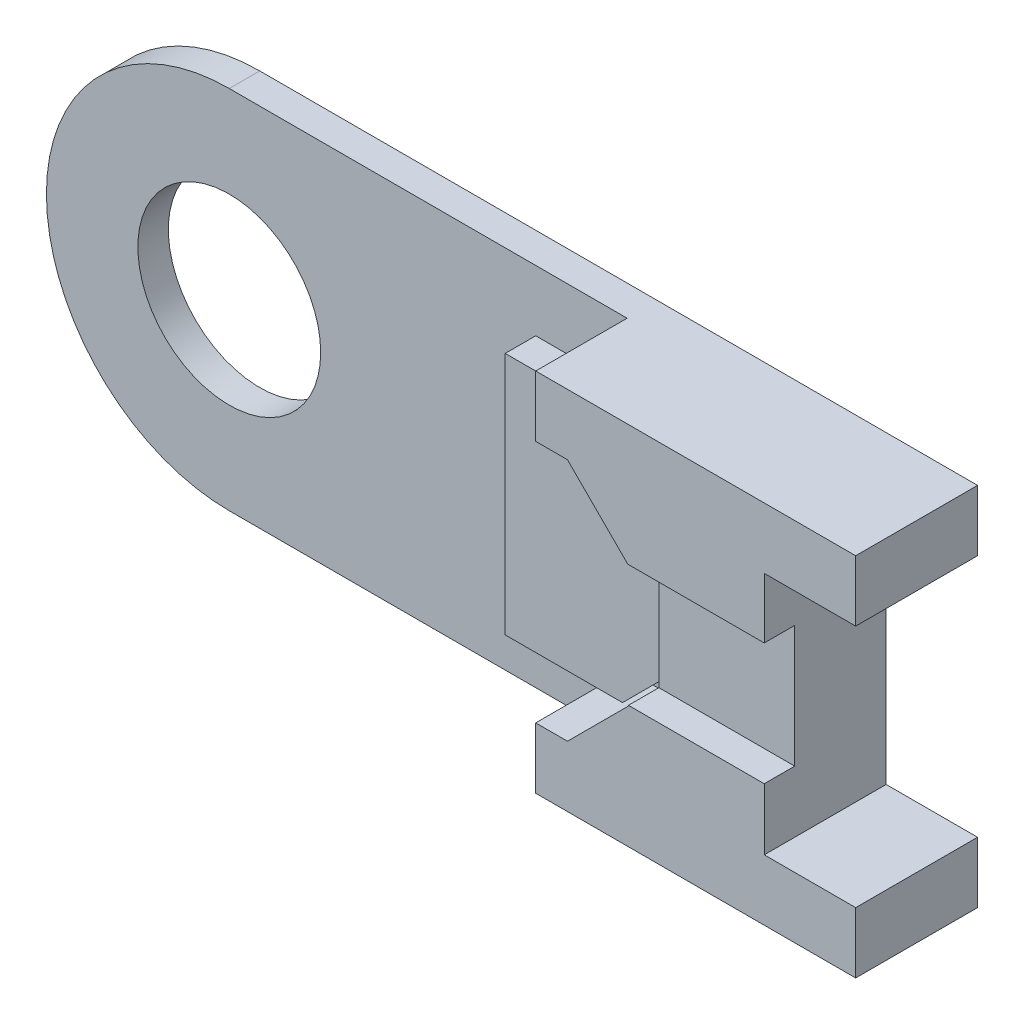
ISO-10303-21;
HEADER;
FILE_DESCRIPTION(('STEP AP214'),'2;1');
FILE_NAME('part.step','',(''),(''),'','','');
FILE_SCHEMA(('AUTOMOTIVE_DESIGN { 1 0 10303 214 1 1 1 1 }'));
ENDSEC;
DATA;
#1=APPLICATION_CONTEXT('core data for automotive mechanical design processes');
#2=APPLICATION_PROTOCOL_DEFINITION('international standard','automotive_design',2000,#1);
#3=PRODUCT_CONTEXT('',#1,'mechanical');
#4=PRODUCT('Part','Part','',(#3));
#5=PRODUCT_RELATED_PRODUCT_CATEGORY('part','',(#4));
#6=PRODUCT_DEFINITION_FORMATION('','',#4);
#7=PRODUCT_DEFINITION_CONTEXT('part definition',#1,'design');
#8=PRODUCT_DEFINITION('design','',#6,#7);
#9=PRODUCT_DEFINITION_SHAPE('','',#8);
#10=(LENGTH_UNIT() NAMED_UNIT(*) SI_UNIT(.MILLI.,.METRE.));
#11=(NAMED_UNIT(*) PLANE_ANGLE_UNIT() SI_UNIT($,.RADIAN.));
#12=(NAMED_UNIT(*) SI_UNIT($,.STERADIAN.) SOLID_ANGLE_UNIT());
#13=UNCERTAINTY_MEASURE_WITH_UNIT(LENGTH_MEASURE(1.E-05),#10,'distance_accuracy_value','');
#14=(GEOMETRIC_REPRESENTATION_CONTEXT(3) GLOBAL_UNCERTAINTY_ASSIGNED_CONTEXT((#13)) GLOBAL_UNIT_ASSIGNED_CONTEXT((#10,
#11,#12)) REPRESENTATION_CONTEXT('',''));
#15=CARTESIAN_POINT('',(0.,0.,0.));
#16=DIRECTION('',(0.,0.,1.));
#17=DIRECTION('',(1.,0.,0.));
#18=AXIS2_PLACEMENT_3D('',#15,#16,#17);
#19=CARTESIAN_POINT('',(-84.3434192007782,60.,10.));
#20=DIRECTION('',(0.,0.,1.));
#21=DIRECTION('',(1.,0.,0.));
#22=AXIS2_PLACEMENT_3D('',#19,#20,#21);
#23=PLANE('',#22);
#24=CARTESIAN_POINT('',(-84.3434192007782,60.,10.));
#25=DIRECTION('',(0.,0.,1.));
#26=DIRECTION('',(1.,0.,0.));
#27=AXIS2_PLACEMENT_3D('',#24,#25,#26);
#28=CIRCLE('',#27,30.);
#29=CARTESIAN_POINT('',(-54.3434192007782,60.,10.));
#30=VERTEX_POINT('',#29);
#31=EDGE_CURVE('E358',#30,#30,#28,.T.);
#32=ORIENTED_EDGE('',*,*,#31,.F.);
#33=EDGE_LOOP('',(#32));
#34=FACE_BOUND('',#33,.T.);
#35=DIRECTION('',(0.,-1.,0.));
#36=VECTOR('',#35,1.);
#37=CARTESIAN_POINT('',(16.2070441422371,100.,10.));
#38=LINE('',#37,#36);
#39=CARTESIAN_POINT('',(16.2070441422371,100.,10.));
#40=VERTEX_POINT('',#39);
#41=CARTESIAN_POINT('',(16.2070441422371,20.,10.));
#42=VERTEX_POINT('',#41);
#43=EDGE_CURVE('E250',#40,#42,#38,.T.);
#44=ORIENTED_EDGE('',*,*,#43,.F.);
#45=DIRECTION('',(-1.,0.,0.));
#46=VECTOR('',#45,1.);
#47=CARTESIAN_POINT('',(46.2070441422371,100.,10.));
#48=LINE('',#47,#46);
#49=CARTESIAN_POINT('',(46.2070441422371,100.,10.));
#50=VERTEX_POINT('',#49);
#51=EDGE_CURVE('E229',#50,#40,#48,.T.);
#52=ORIENTED_EDGE('',*,*,#51,.F.);
#53=DIRECTION('',(0.,1.,0.));
#54=VECTOR('',#53,1.);
#55=CARTESIAN_POINT('',(46.2070441422371,60.,10.));
#56=LINE('',#55,#54);
#57=CARTESIAN_POINT('',(46.2070441422371,120.,10.));
#58=VERTEX_POINT('',#57);
#59=EDGE_CURVE('E353',#50,#58,#56,.T.);
#60=ORIENTED_EDGE('',*,*,#59,.T.);
#61=DIRECTION('',(-1.,0.,0.));
#62=VECTOR('',#61,1.);
#63=CARTESIAN_POINT('',(46.2070441422371,120.,10.));
#64=LINE('',#63,#62);
#65=CARTESIAN_POINT('',(-84.3434192007782,120.,10.));
#66=VERTEX_POINT('',#65);
#67=EDGE_CURVE('E367',#58,#66,#64,.T.);
#68=ORIENTED_EDGE('',*,*,#67,.T.);
#69=CARTESIAN_POINT('',(-84.3434192007782,60.,10.));
#70=DIRECTION('',(0.,0.,1.));
#71=DIRECTION('',(1.,0.,0.));
#72=AXIS2_PLACEMENT_3D('',#69,#70,#71);
#73=CIRCLE('',#72,60.);
#74=CARTESIAN_POINT('',(-84.3434192007782,0.,10.));
#75=VERTEX_POINT('',#74);
#76=EDGE_CURVE('E370',#66,#75,#73,.T.);
#77=ORIENTED_EDGE('',*,*,#76,.T.);
#78=DIRECTION('',(1.,0.,0.));
#79=VECTOR('',#78,1.);
#80=CARTESIAN_POINT('',(0.,0.,10.));
#81=LINE('',#80,#79);
#82=CARTESIAN_POINT('',(46.2070441422371,0.,10.));
#83=VERTEX_POINT('',#82);
#84=EDGE_CURVE('E364',#75,#83,#81,.T.);
#85=ORIENTED_EDGE('',*,*,#84,.T.);
#86=CARTESIAN_POINT('',(46.2070441422371,20.,10.));
#87=VERTEX_POINT('',#86);
#88=EDGE_CURVE('E354',#83,#87,#56,.T.);
#89=ORIENTED_EDGE('',*,*,#88,.T.);
#90=DIRECTION('',(1.,0.,0.));
#91=VECTOR('',#90,1.);
#92=CARTESIAN_POINT('',(46.2070441422371,20.,10.));
#93=LINE('',#92,#91);
#94=EDGE_CURVE('E252',#42,#87,#93,.T.);
#95=ORIENTED_EDGE('',*,*,#94,.F.);
#96=EDGE_LOOP('',(#44,#52,#60,#68,#77,#85,#89,#95));
#97=FACE_BOUND('',#96,.T.);
#98=ADVANCED_FACE('F38',(#34,#97),#23,.T.);
#99=DIRECTION('',(0.,1.,0.));
#100=VECTOR('',#99,1.);
#101=CARTESIAN_POINT('',(76.6336353854819,80.,10.));
#102=LINE('',#101,#100);
#103=CARTESIAN_POINT('',(76.6336353854819,40.,10.));
#104=VERTEX_POINT('',#103);
#105=CARTESIAN_POINT('',(76.6336353854819,41.9402051154966,10.));
#106=VERTEX_POINT('',#105);
#107=EDGE_CURVE('E265',#104,#106,#102,.T.);
#108=ORIENTED_EDGE('',*,*,#107,.T.);
#109=DIRECTION('',(0.707106781186548,0.707106781186548,0.));
#110=VECTOR('',#109,1.);
#111=CARTESIAN_POINT('',(54.6934302699853,20.,10.));
#112=LINE('',#111,#110);
#113=CARTESIAN_POINT('',(54.6934302699853,20.,10.));
#114=VERTEX_POINT('',#113);
#115=EDGE_CURVE('E223',#114,#106,#112,.T.);
#116=ORIENTED_EDGE('',*,*,#115,.F.);
#117=DIRECTION('',(1.,0.,0.));
#118=VECTOR('',#117,1.);
#119=CARTESIAN_POINT('',(19.5990862433128,20.,10.));
#120=LINE('',#119,#118);
#121=CARTESIAN_POINT('',(56.6336353854819,20.,10.));
#122=VERTEX_POINT('',#121);
#123=EDGE_CURVE('E259',#114,#122,#120,.T.);
#124=ORIENTED_EDGE('',*,*,#123,.T.);
#125=DIRECTION('',(0.707106781186548,0.707106781186548,0.));
#126=VECTOR('',#125,1.);
#127=CARTESIAN_POINT('',(56.6336353854819,20.,10.));
#128=LINE('',#127,#126);
#129=EDGE_CURVE('E261',#122,#104,#128,.T.);
#130=ORIENTED_EDGE('',*,*,#129,.T.);
#131=EDGE_LOOP('',(#108,#116,#124,#130));
#132=FACE_BOUND('',#131,.T.);
#133=ADVANCED_FACE('F455',(#132),#23,.T.);
#134=CARTESIAN_POINT('',(19.5990862433128,20.,10.));
#135=DIRECTION('',(0.,-1.,0.));
#136=DIRECTION('',(1.,0.,0.));
#137=AXIS2_PLACEMENT_3D('',#134,#135,#136);
#138=PLANE('',#137);
#139=DIRECTION('',(0.,0.,-1.));
#140=VECTOR('',#139,1.);
#141=CARTESIAN_POINT('',(54.6934302699853,20.,20.));
#142=LINE('',#141,#140);
#143=CARTESIAN_POINT('',(54.6934302699853,20.,20.));
#144=VERTEX_POINT('',#143);
#145=EDGE_CURVE('E256',#144,#114,#142,.T.);
#146=ORIENTED_EDGE('',*,*,#145,.F.);
#147=DIRECTION('',(1.,0.,0.));
#148=VECTOR('',#147,1.);
#149=CARTESIAN_POINT('',(16.2070441422371,20.,20.));
#150=LINE('',#149,#148);
#151=CARTESIAN_POINT('',(46.2070441422371,20.,20.));
#152=VERTEX_POINT('',#151);
#153=EDGE_CURVE('E238',#152,#144,#150,.T.);
#154=ORIENTED_EDGE('',*,*,#153,.F.);
#155=DIRECTION('',(0.,0.,-1.));
#156=VECTOR('',#155,1.);
#157=CARTESIAN_POINT('',(46.2070441422371,20.,40.));
#158=LINE('',#157,#156);
#159=CARTESIAN_POINT('',(46.2070441422371,20.,40.));
#160=VERTEX_POINT('',#159);
#161=EDGE_CURVE('E293',#160,#152,#158,.T.);
#162=ORIENTED_EDGE('',*,*,#161,.F.);
#163=DIRECTION('',(1.,0.,0.));
#164=VECTOR('',#163,1.);
#165=CARTESIAN_POINT('',(19.5990862433128,20.,40.));
#166=LINE('',#165,#164);
#167=CARTESIAN_POINT('',(56.6336353854819,20.,40.));
#168=VERTEX_POINT('',#167);
#169=EDGE_CURVE('E232',#160,#168,#166,.T.);
#170=ORIENTED_EDGE('',*,*,#169,.T.);
#171=DIRECTION('',(0.,0.,1.));
#172=VECTOR('',#171,1.);
#173=CARTESIAN_POINT('',(56.6336353854819,20.,10.));
#174=LINE('',#173,#172);
#175=EDGE_CURVE('E268',#122,#168,#174,.T.);
#176=ORIENTED_EDGE('',*,*,#175,.F.);
#177=ORIENTED_EDGE('',*,*,#123,.F.);
#178=EDGE_LOOP('',(#146,#154,#162,#170,#176,#177));
#179=FACE_BOUND('',#178,.T.);
#180=ADVANCED_FACE('F451',(#179),#138,.F.);
#181=CARTESIAN_POINT('',(76.6336353854819,80.,10.));
#182=DIRECTION('',(1.,0.,0.));
#183=DIRECTION('',(0.,1.,0.));
#184=AXIS2_PLACEMENT_3D('',#181,#182,#183);
#185=PLANE('',#184);
#186=DIRECTION('',(0.,0.,-1.));
#187=VECTOR('',#186,1.);
#188=CARTESIAN_POINT('',(76.6336353854819,41.9402051154966,20.));
#189=LINE('',#188,#187);
#190=CARTESIAN_POINT('',(76.6336353854819,41.9402051154966,20.));
#191=VERTEX_POINT('',#190);
#192=EDGE_CURVE('E53',#191,#106,#189,.T.);
#193=ORIENTED_EDGE('',*,*,#192,.T.);
#194=ORIENTED_EDGE('',*,*,#107,.F.);
#195=DIRECTION('',(0.,0.,1.));
#196=VECTOR('',#195,1.);
#197=CARTESIAN_POINT('',(76.6336353854819,40.,10.));
#198=LINE('',#197,#196);
#199=CARTESIAN_POINT('',(76.6336353854819,40.,40.));
#200=VERTEX_POINT('',#199);
#201=EDGE_CURVE('E284',#104,#200,#198,.T.);
#202=ORIENTED_EDGE('',*,*,#201,.T.);
#203=DIRECTION('',(0.,1.,0.));
#204=VECTOR('',#203,1.);
#205=CARTESIAN_POINT('',(76.6336353854819,80.,40.));
#206=LINE('',#205,#204);
#207=CARTESIAN_POINT('',(76.6336353854819,40.2090922157293,40.));
#208=VERTEX_POINT('',#207);
#209=EDGE_CURVE('E273',#200,#208,#206,.T.);
#210=ORIENTED_EDGE('',*,*,#209,.T.);
#211=DIRECTION('',(0.,0.,1.));
#212=VECTOR('',#211,1.);
#213=CARTESIAN_POINT('',(76.6336353854819,40.2090922157293,30.));
#214=LINE('',#213,#212);
#215=CARTESIAN_POINT('',(76.6336353854819,40.2090922157293,30.));
#216=VERTEX_POINT('',#215);
#217=EDGE_CURVE('E61',#216,#208,#214,.T.);
#218=ORIENTED_EDGE('',*,*,#217,.F.);
#219=DIRECTION('',(0.,-1.,0.));
#220=VECTOR('',#219,1.);
#221=CARTESIAN_POINT('',(76.6336353854819,0.,30.));
#222=LINE('',#221,#220);
#223=CARTESIAN_POINT('',(76.6336353854819,80.,30.));
#224=VERTEX_POINT('',#223);
#225=EDGE_CURVE('E46',#224,#216,#222,.T.);
#226=ORIENTED_EDGE('',*,*,#225,.F.);
#227=DIRECTION('',(0.,0.,1.));
#228=VECTOR('',#227,1.);
#229=CARTESIAN_POINT('',(76.6336353854819,80.,10.));
#230=LINE('',#229,#228);
#231=CARTESIAN_POINT('',(76.6336353854819,80.,20.));
#232=VERTEX_POINT('',#231);
#233=EDGE_CURVE('E282',#232,#224,#230,.T.);
#234=ORIENTED_EDGE('',*,*,#233,.F.);
#235=DIRECTION('',(0.,1.,0.));
#236=VECTOR('',#235,1.);
#237=CARTESIAN_POINT('',(76.6336353854819,41.9402051154966,20.));
#238=LINE('',#237,#236);
#239=EDGE_CURVE('E245',#191,#232,#238,.T.);
#240=ORIENTED_EDGE('',*,*,#239,.F.);
#241=EDGE_LOOP('',(#193,#194,#202,#210,#218,#226,#234,#240));
#242=FACE_BOUND('',#241,.T.);
#243=ADVANCED_FACE('F443',(#242),#185,.F.);
#244=CARTESIAN_POINT('',(46.2070441422371,120.,40.));
#245=DIRECTION('',(1.,0.,0.));
#246=DIRECTION('',(0.,1.,0.));
#247=AXIS2_PLACEMENT_3D('',#244,#245,#246);
#248=PLANE('',#247);
#249=ORIENTED_EDGE('',*,*,#59,.F.);
#250=DIRECTION('',(0.,0.,1.));
#251=VECTOR('',#250,1.);
#252=CARTESIAN_POINT('',(46.2070441422371,100.,40.));
#253=LINE('',#252,#251);
#254=CARTESIAN_POINT('',(46.2070441422371,100.,20.));
#255=VERTEX_POINT('',#254);
#256=EDGE_CURVE('E297',#50,#255,#253,.T.);
#257=ORIENTED_EDGE('',*,*,#256,.T.);
#258=CARTESIAN_POINT('',(46.2070441422371,100.,40.));
#259=VERTEX_POINT('',#258);
#260=EDGE_CURVE('E296',#255,#259,#253,.T.);
#261=ORIENTED_EDGE('',*,*,#260,.T.);
#262=DIRECTION('',(0.,-1.,0.));
#263=VECTOR('',#262,1.);
#264=CARTESIAN_POINT('',(46.2070441422371,120.,40.));
#265=LINE('',#264,#263);
#266=CARTESIAN_POINT('',(46.2070441422371,120.,40.));
#267=VERTEX_POINT('',#266);
#268=EDGE_CURVE('E341',#267,#259,#265,.T.);
#269=ORIENTED_EDGE('',*,*,#268,.F.);
#270=DIRECTION('',(0.,0.,-1.));
#271=VECTOR('',#270,1.);
#272=CARTESIAN_POINT('',(46.2070441422371,120.,40.));
#273=LINE('',#272,#271);
#274=EDGE_CURVE('E350',#267,#58,#273,.T.);
#275=ORIENTED_EDGE('',*,*,#274,.T.);
#276=EDGE_LOOP('',(#249,#257,#261,#269,#275));
#277=FACE_BOUND('',#276,.T.);
#278=ADVANCED_FACE('F510',(#277),#248,.F.);
#279=CARTESIAN_POINT('',(0.,0.,40.));
#280=DIRECTION('',(0.,0.,-1.));
#281=DIRECTION('',(-1.,0.,0.));
#282=AXIS2_PLACEMENT_3D('',#279,#280,#281);
#283=PLANE('',#282);
#284=ORIENTED_EDGE('',*,*,#268,.T.);
#285=DIRECTION('',(-1.,0.,0.));
#286=VECTOR('',#285,1.);
#287=CARTESIAN_POINT('',(19.5990862433128,100.,40.));
#288=LINE('',#287,#286);
#289=CARTESIAN_POINT('',(56.6336353854819,100.,40.));
#290=VERTEX_POINT('',#289);
#291=EDGE_CURVE('E262',#290,#259,#288,.T.);
#292=ORIENTED_EDGE('',*,*,#291,.F.);
#293=DIRECTION('',(-0.707106781186547,0.707106781186548,0.));
#294=VECTOR('',#293,1.);
#295=CARTESIAN_POINT('',(56.6336353854819,100.,40.));
#296=LINE('',#295,#294);
#297=CARTESIAN_POINT('',(76.5427291982134,80.0909061872685,40.));
#298=VERTEX_POINT('',#297);
#299=EDGE_CURVE('E275',#298,#290,#296,.T.);
#300=ORIENTED_EDGE('',*,*,#299,.F.);
#301=DIRECTION('',(0.,-1.,0.));
#302=VECTOR('',#301,1.);
#303=CARTESIAN_POINT('',(76.5427291982134,80.2090922157293,40.));
#304=LINE('',#303,#302);
#305=CARTESIAN_POINT('',(76.5427291982134,80.2090922157293,40.));
#306=VERTEX_POINT('',#305);
#307=EDGE_CURVE('E311',#306,#298,#304,.T.);
#308=ORIENTED_EDGE('',*,*,#307,.F.);
#309=DIRECTION('',(-1.,0.,0.));
#310=VECTOR('',#309,1.);
#311=CARTESIAN_POINT('',(121.542729198213,80.2090922157293,40.));
#312=LINE('',#311,#310);
#313=CARTESIAN_POINT('',(121.207044142237,80.2090922157293,40.));
#314=VERTEX_POINT('',#313);
#315=EDGE_CURVE('E300',#314,#306,#312,.T.);
#316=ORIENTED_EDGE('',*,*,#315,.F.);
#317=DIRECTION('',(0.,-1.,0.));
#318=VECTOR('',#317,1.);
#319=CARTESIAN_POINT('',(121.207044142237,0.,40.));
#320=LINE('',#319,#318);
#321=CARTESIAN_POINT('',(121.207044142237,100.,40.));
#322=VERTEX_POINT('',#321);
#323=EDGE_CURVE('E394',#322,#314,#320,.T.);
#324=ORIENTED_EDGE('',*,*,#323,.F.);
#325=DIRECTION('',(1.,0.,0.));
#326=VECTOR('',#325,1.);
#327=CARTESIAN_POINT('',(0.,100.,40.));
#328=LINE('',#327,#326);
#329=CARTESIAN_POINT('',(151.207044142237,100.,40.));
#330=VERTEX_POINT('',#329);
#331=EDGE_CURVE('E400',#322,#330,#328,.T.);
#332=ORIENTED_EDGE('',*,*,#331,.T.);
#333=DIRECTION('',(0.,1.,0.));
#334=VECTOR('',#333,1.);
#335=CARTESIAN_POINT('',(151.207044142237,120.,40.));
#336=LINE('',#335,#334);
#337=CARTESIAN_POINT('',(151.207044142237,120.,40.));
#338=VERTEX_POINT('',#337);
#339=EDGE_CURVE('E334',#330,#338,#336,.T.);
#340=ORIENTED_EDGE('',*,*,#339,.T.);
#341=DIRECTION('',(-1.,0.,0.));
#342=VECTOR('',#341,1.);
#343=CARTESIAN_POINT('',(151.207044142237,120.,40.));
#344=LINE('',#343,#342);
#345=EDGE_CURVE('E338',#338,#267,#344,.T.);
#346=ORIENTED_EDGE('',*,*,#345,.T.);
#347=EDGE_LOOP('',(#284,#292,#300,#308,#316,#324,#332,#340,#346));
#348=FACE_BOUND('',#347,.T.);
#349=ADVANCED_FACE('F437',(#348),#283,.F.);
#350=CARTESIAN_POINT('',(151.207044142237,0.,10.));
#351=DIRECTION('',(-1.,0.,0.));
#352=DIRECTION('',(0.,0.,1.));
#353=AXIS2_PLACEMENT_3D('',#350,#351,#352);
#354=PLANE('',#353);
#355=ORIENTED_EDGE('',*,*,#339,.F.);
#356=DIRECTION('',(0.,0.,1.));
#357=VECTOR('',#356,1.);
#358=CARTESIAN_POINT('',(151.207044142237,100.,55.9858593321826));
#359=LINE('',#358,#357);
#360=CARTESIAN_POINT('',(151.207044142237,100.,0.));
#361=VERTEX_POINT('',#360);
#362=EDGE_CURVE('E322',#361,#330,#359,.T.);
#363=ORIENTED_EDGE('',*,*,#362,.F.);
#364=DIRECTION('',(0.,1.,0.));
#365=VECTOR('',#364,1.);
#366=CARTESIAN_POINT('',(151.207044142237,0.,0.));
#367=LINE('',#366,#365);
#368=CARTESIAN_POINT('',(151.207044142237,120.,0.));
#369=VERTEX_POINT('',#368);
#370=EDGE_CURVE('E374',#361,#369,#367,.T.);
#371=ORIENTED_EDGE('',*,*,#370,.T.);
#372=DIRECTION('',(0.,0.,-1.));
#373=VECTOR('',#372,1.);
#374=CARTESIAN_POINT('',(151.207044142237,120.,10.));
#375=LINE('',#374,#373);
#376=EDGE_CURVE('E387',#338,#369,#375,.T.);
#377=ORIENTED_EDGE('',*,*,#376,.F.);
#378=EDGE_LOOP('',(#355,#363,#371,#377));
#379=FACE_BOUND('',#378,.T.);
#380=ADVANCED_FACE('F501',(#379),#354,.F.);
#381=CARTESIAN_POINT('',(-84.3434192007782,60.,0.));
#382=DIRECTION('',(0.,0.,1.));
#383=DIRECTION('',(1.,0.,0.));
#384=AXIS2_PLACEMENT_3D('',#381,#382,#383);
#385=PLANE('',#384);
#386=ORIENTED_EDGE('',*,*,#370,.F.);
#387=DIRECTION('',(-1.,0.,0.));
#388=VECTOR('',#387,1.);
#389=CARTESIAN_POINT('',(-84.3434192007782,100.,0.));
#390=LINE('',#389,#388);
#391=CARTESIAN_POINT('',(121.207044142237,100.,0.));
#392=VERTEX_POINT('',#391);
#393=EDGE_CURVE('E331',#361,#392,#390,.T.);
#394=ORIENTED_EDGE('',*,*,#393,.T.);
#395=DIRECTION('',(0.,1.,0.));
#396=VECTOR('',#395,1.);
#397=CARTESIAN_POINT('',(121.207044142237,60.,0.));
#398=LINE('',#397,#396);
#399=CARTESIAN_POINT('',(121.207044142237,20.,0.));
#400=VERTEX_POINT('',#399);
#401=EDGE_CURVE('E324',#400,#392,#398,.T.);
#402=ORIENTED_EDGE('',*,*,#401,.F.);
#403=DIRECTION('',(1.,0.,0.));
#404=VECTOR('',#403,1.);
#405=CARTESIAN_POINT('',(-84.3434192007782,20.,0.));
#406=LINE('',#405,#404);
#407=CARTESIAN_POINT('',(151.207044142237,20.,0.));
#408=VERTEX_POINT('',#407);
#409=EDGE_CURVE('E328',#400,#408,#406,.T.);
#410=ORIENTED_EDGE('',*,*,#409,.T.);
#411=CARTESIAN_POINT('',(151.207044142237,0.,0.));
#412=VERTEX_POINT('',#411);
#413=EDGE_CURVE('E375',#412,#408,#367,.T.);
#414=ORIENTED_EDGE('',*,*,#413,.F.);
#415=DIRECTION('',(1.,0.,0.));
#416=VECTOR('',#415,1.);
#417=CARTESIAN_POINT('',(0.,0.,0.));
#418=LINE('',#417,#416);
#419=CARTESIAN_POINT('',(-84.3434192007782,0.,0.));
#420=VERTEX_POINT('',#419);
#421=EDGE_CURVE('E361',#420,#412,#418,.T.);
#422=ORIENTED_EDGE('',*,*,#421,.F.);
#423=CARTESIAN_POINT('',(-84.3434192007782,60.,0.));
#424=DIRECTION('',(0.,0.,1.));
#425=DIRECTION('',(1.,0.,0.));
#426=AXIS2_PLACEMENT_3D('',#423,#424,#425);
#427=CIRCLE('',#426,60.);
#428=CARTESIAN_POINT('',(-84.3434192007782,120.,0.));
#429=VERTEX_POINT('',#428);
#430=EDGE_CURVE('E368',#429,#420,#427,.T.);
#431=ORIENTED_EDGE('',*,*,#430,.F.);
#432=DIRECTION('',(-1.,0.,0.));
#433=VECTOR('',#432,1.);
#434=CARTESIAN_POINT('',(46.2070441422371,120.,0.));
#435=LINE('',#434,#433);
#436=EDGE_CURVE('E378',#369,#429,#435,.T.);
#437=ORIENTED_EDGE('',*,*,#436,.F.);
#438=EDGE_LOOP('',(#386,#394,#402,#410,#414,#422,#431,#437));
#439=FACE_BOUND('',#438,.T.);
#440=CARTESIAN_POINT('',(-84.3434192007782,60.,0.));
#441=DIRECTION('',(0.,0.,1.));
#442=DIRECTION('',(1.,0.,0.));
#443=AXIS2_PLACEMENT_3D('',#440,#441,#442);
#444=CIRCLE('',#443,30.);
#445=CARTESIAN_POINT('',(-54.3434192007782,60.,0.));
#446=VERTEX_POINT('',#445);
#447=EDGE_CURVE('E357',#446,#446,#444,.T.);
#448=ORIENTED_EDGE('',*,*,#447,.T.);
#449=EDGE_LOOP('',(#448));
#450=FACE_BOUND('',#449,.T.);
#451=ADVANCED_FACE('F471',(#439,#450),#385,.F.);
#452=CARTESIAN_POINT('',(0.,0.,10.));
#453=DIRECTION('',(0.,1.,0.));
#454=DIRECTION('',(0.,0.,1.));
#455=AXIS2_PLACEMENT_3D('',#452,#453,#454);
#456=PLANE('',#455);
#457=DIRECTION('',(0.,0.,-1.));
#458=VECTOR('',#457,1.);
#459=CARTESIAN_POINT('',(151.207044142237,0.,10.));
#460=LINE('',#459,#458);
#461=CARTESIAN_POINT('',(151.207044142237,0.,40.));
#462=VERTEX_POINT('',#461);
#463=EDGE_CURVE('E390',#462,#412,#460,.T.);
#464=ORIENTED_EDGE('',*,*,#463,.F.);
#465=DIRECTION('',(1.,0.,0.));
#466=VECTOR('',#465,1.);
#467=CARTESIAN_POINT('',(151.207044142237,0.,40.));
#468=LINE('',#467,#466);
#469=CARTESIAN_POINT('',(46.2070441422371,0.,40.));
#470=VERTEX_POINT('',#469);
#471=EDGE_CURVE('E344',#470,#462,#468,.T.);
#472=ORIENTED_EDGE('',*,*,#471,.F.);
#473=DIRECTION('',(0.,0.,-1.));
#474=VECTOR('',#473,1.);
#475=CARTESIAN_POINT('',(46.2070441422371,0.,40.));
#476=LINE('',#475,#474);
#477=EDGE_CURVE('E347',#470,#83,#476,.T.);
#478=ORIENTED_EDGE('',*,*,#477,.T.);
#479=ORIENTED_EDGE('',*,*,#84,.F.);
#480=DIRECTION('',(0.,0.,-1.));
#481=VECTOR('',#480,1.);
#482=CARTESIAN_POINT('',(-84.3434192007782,0.,10.));
#483=LINE('',#482,#481);
#484=EDGE_CURVE('E372',#75,#420,#483,.T.);
#485=ORIENTED_EDGE('',*,*,#484,.T.);
#486=ORIENTED_EDGE('',*,*,#421,.T.);
#487=EDGE_LOOP('',(#464,#472,#478,#479,#485,#486));
#488=FACE_BOUND('',#487,.T.);
#489=ADVANCED_FACE('F40',(#488),#456,.F.);
#490=ORIENTED_EDGE('',*,*,#413,.T.);
#491=DIRECTION('',(0.,0.,-1.));
#492=VECTOR('',#491,1.);
#493=CARTESIAN_POINT('',(151.207044142237,20.,55.9858593321826));
#494=LINE('',#493,#492);
#495=CARTESIAN_POINT('',(151.207044142237,20.,40.));
#496=VERTEX_POINT('',#495);
#497=EDGE_CURVE('E317',#496,#408,#494,.T.);
#498=ORIENTED_EDGE('',*,*,#497,.F.);
#499=EDGE_CURVE('E335',#462,#496,#336,.T.);
#500=ORIENTED_EDGE('',*,*,#499,.F.);
#501=ORIENTED_EDGE('',*,*,#463,.T.);
#502=EDGE_LOOP('',(#490,#498,#500,#501));
#503=FACE_BOUND('',#502,.T.);
#504=ADVANCED_FACE('F474',(#503),#354,.F.);
#505=CARTESIAN_POINT('',(46.2070441422371,120.,10.));
#506=DIRECTION('',(0.,-1.,0.));
#507=DIRECTION('',(1.,0.,0.));
#508=AXIS2_PLACEMENT_3D('',#505,#506,#507);
#509=PLANE('',#508);
#510=ORIENTED_EDGE('',*,*,#436,.T.);
#511=DIRECTION('',(0.,0.,-1.));
#512=VECTOR('',#511,1.);
#513=CARTESIAN_POINT('',(-84.3434192007782,120.,10.));
#514=LINE('',#513,#512);
#515=EDGE_CURVE('E384',#66,#429,#514,.T.);
#516=ORIENTED_EDGE('',*,*,#515,.F.);
#517=ORIENTED_EDGE('',*,*,#67,.F.);
#518=ORIENTED_EDGE('',*,*,#274,.F.);
#519=ORIENTED_EDGE('',*,*,#345,.F.);
#520=ORIENTED_EDGE('',*,*,#376,.T.);
#521=EDGE_LOOP('',(#510,#516,#517,#518,#519,#520));
#522=FACE_BOUND('',#521,.T.);
#523=ADVANCED_FACE('F497',(#522),#509,.F.);
#524=CARTESIAN_POINT('',(-84.3434192007782,60.,10.));
#525=DIRECTION('',(0.,0.,-1.));
#526=DIRECTION('',(-1.,0.,0.));
#527=AXIS2_PLACEMENT_3D('',#524,#525,#526);
#528=CYLINDRICAL_SURFACE('',#527,60.);
#529=ORIENTED_EDGE('',*,*,#430,.T.);
#530=ORIENTED_EDGE('',*,*,#484,.F.);
#531=ORIENTED_EDGE('',*,*,#76,.F.);
#532=ORIENTED_EDGE('',*,*,#515,.T.);
#533=EDGE_LOOP('',(#529,#530,#531,#532));
#534=FACE_BOUND('',#533,.T.);
#535=ADVANCED_FACE('F491',(#534),#528,.T.);
#536=CARTESIAN_POINT('',(-84.3434192007782,60.,10.));
#537=DIRECTION('',(0.,0.,-1.));
#538=DIRECTION('',(-1.,0.,0.));
#539=AXIS2_PLACEMENT_3D('',#536,#537,#538);
#540=CYLINDRICAL_SURFACE('',#539,30.);
#541=ORIENTED_EDGE('',*,*,#31,.T.);
#542=EDGE_LOOP('',(#541));
#543=FACE_BOUND('',#542,.T.);
#544=ORIENTED_EDGE('',*,*,#447,.F.);
#545=EDGE_LOOP('',(#544));
#546=FACE_BOUND('',#545,.T.);
#547=ADVANCED_FACE('F533',(#543,#546),#540,.F.);
#548=EDGE_CURVE('E340',#160,#470,#265,.T.);
#549=ORIENTED_EDGE('',*,*,#548,.F.);
#550=ORIENTED_EDGE('',*,*,#161,.T.);
#551=EDGE_CURVE('E292',#152,#87,#158,.T.);
#552=ORIENTED_EDGE('',*,*,#551,.T.);
#553=ORIENTED_EDGE('',*,*,#88,.F.);
#554=ORIENTED_EDGE('',*,*,#477,.F.);
#555=EDGE_LOOP('',(#549,#550,#552,#553,#554));
#556=FACE_BOUND('',#555,.T.);
#557=ADVANCED_FACE('F481',(#556),#248,.F.);
#558=DIRECTION('',(1.,0.,0.));
#559=VECTOR('',#558,1.);
#560=CARTESIAN_POINT('',(121.542729198213,40.2090922157293,40.));
#561=LINE('',#560,#559);
#562=CARTESIAN_POINT('',(121.207044142237,40.2090922157293,40.));
#563=VERTEX_POINT('',#562);
#564=EDGE_CURVE('E304',#208,#563,#561,.T.);
#565=ORIENTED_EDGE('',*,*,#564,.F.);
#566=ORIENTED_EDGE('',*,*,#209,.F.);
#567=DIRECTION('',(0.707106781186548,0.707106781186548,0.));
#568=VECTOR('',#567,1.);
#569=CARTESIAN_POINT('',(56.6336353854819,20.,40.));
#570=LINE('',#569,#568);
#571=EDGE_CURVE('E270',#168,#200,#570,.T.);
#572=ORIENTED_EDGE('',*,*,#571,.F.);
#573=ORIENTED_EDGE('',*,*,#169,.F.);
#574=ORIENTED_EDGE('',*,*,#548,.T.);
#575=ORIENTED_EDGE('',*,*,#471,.T.);
#576=ORIENTED_EDGE('',*,*,#499,.T.);
#577=DIRECTION('',(-1.,0.,0.));
#578=VECTOR('',#577,1.);
#579=CARTESIAN_POINT('',(0.,20.,40.));
#580=LINE('',#579,#578);
#581=CARTESIAN_POINT('',(121.207044142237,20.,40.));
#582=VERTEX_POINT('',#581);
#583=EDGE_CURVE('E397',#496,#582,#580,.T.);
#584=ORIENTED_EDGE('',*,*,#583,.T.);
#585=EDGE_CURVE('E393',#563,#582,#320,.T.);
#586=ORIENTED_EDGE('',*,*,#585,.F.);
#587=EDGE_LOOP('',(#565,#566,#572,#573,#574,#575,#576,#584,#586));
#588=FACE_BOUND('',#587,.T.);
#589=ADVANCED_FACE('F462',(#588),#283,.F.);
#590=CARTESIAN_POINT('',(121.207044142237,100.,55.9858593321826));
#591=DIRECTION('',(0.,1.,0.));
#592=DIRECTION('',(0.,0.,1.));
#593=AXIS2_PLACEMENT_3D('',#590,#591,#592);
#594=PLANE('',#593);
#595=ORIENTED_EDGE('',*,*,#362,.T.);
#596=ORIENTED_EDGE('',*,*,#331,.F.);
#597=DIRECTION('',(0.,0.,1.));
#598=VECTOR('',#597,1.);
#599=CARTESIAN_POINT('',(121.207044142237,100.,55.9858593321826));
#600=LINE('',#599,#598);
#601=EDGE_CURVE('E321',#392,#322,#600,.T.);
#602=ORIENTED_EDGE('',*,*,#601,.F.);
#603=ORIENTED_EDGE('',*,*,#393,.F.);
#604=EDGE_LOOP('',(#595,#596,#602,#603));
#605=FACE_BOUND('',#604,.T.);
#606=ADVANCED_FACE('F505',(#605),#594,.F.);
#607=CARTESIAN_POINT('',(121.207044142237,20.,55.9858593321826));
#608=DIRECTION('',(0.,-1.,0.));
#609=DIRECTION('',(0.,0.,-1.));
#610=AXIS2_PLACEMENT_3D('',#607,#608,#609);
#611=PLANE('',#610);
#612=DIRECTION('',(0.,0.,-1.));
#613=VECTOR('',#612,1.);
#614=CARTESIAN_POINT('',(121.207044142237,20.,55.9858593321826));
#615=LINE('',#614,#613);
#616=EDGE_CURVE('E318',#582,#400,#615,.T.);
#617=ORIENTED_EDGE('',*,*,#616,.F.);
#618=ORIENTED_EDGE('',*,*,#583,.F.);
#619=ORIENTED_EDGE('',*,*,#497,.T.);
#620=ORIENTED_EDGE('',*,*,#409,.F.);
#621=EDGE_LOOP('',(#617,#618,#619,#620));
#622=FACE_BOUND('',#621,.T.);
#623=ADVANCED_FACE('F466',(#622),#611,.F.);
#624=CARTESIAN_POINT('',(121.207044142237,0.,0.));
#625=DIRECTION('',(1.,0.,0.));
#626=DIRECTION('',(0.,0.,-1.));
#627=AXIS2_PLACEMENT_3D('',#624,#625,#626);
#628=PLANE('',#627);
#629=DIRECTION('',(0.,0.,-1.));
#630=VECTOR('',#629,1.);
#631=CARTESIAN_POINT('',(121.207044142237,40.2090922157293,0.));
#632=LINE('',#631,#630);
#633=CARTESIAN_POINT('',(121.207044142237,40.2090922157293,30.));
#634=VERTEX_POINT('',#633);
#635=EDGE_CURVE('E407',#563,#634,#632,.T.);
#636=ORIENTED_EDGE('',*,*,#635,.F.);
#637=ORIENTED_EDGE('',*,*,#585,.T.);
#638=ORIENTED_EDGE('',*,*,#616,.T.);
#639=ORIENTED_EDGE('',*,*,#401,.T.);
#640=ORIENTED_EDGE('',*,*,#601,.T.);
#641=ORIENTED_EDGE('',*,*,#323,.T.);
#642=DIRECTION('',(0.,0.,1.));
#643=VECTOR('',#642,1.);
#644=CARTESIAN_POINT('',(121.207044142237,80.2090922157293,0.));
#645=LINE('',#644,#643);
#646=CARTESIAN_POINT('',(121.207044142237,80.2090922157293,30.));
#647=VERTEX_POINT('',#646);
#648=EDGE_CURVE('E405',#647,#314,#645,.T.);
#649=ORIENTED_EDGE('',*,*,#648,.F.);
#650=DIRECTION('',(0.,1.,0.));
#651=VECTOR('',#650,1.);
#652=CARTESIAN_POINT('',(121.207044142237,0.,30.));
#653=LINE('',#652,#651);
#654=EDGE_CURVE('E403',#634,#647,#653,.T.);
#655=ORIENTED_EDGE('',*,*,#654,.F.);
#656=EDGE_LOOP('',(#636,#637,#638,#639,#640,#641,#649,#655));
#657=FACE_BOUND('',#656,.T.);
#658=ADVANCED_FACE('F421',(#657),#628,.T.);
#659=CARTESIAN_POINT('',(121.542729198213,40.2090922157293,30.));
#660=DIRECTION('',(0.,-1.,0.));
#661=DIRECTION('',(1.,0.,0.));
#662=AXIS2_PLACEMENT_3D('',#659,#660,#661);
#663=PLANE('',#662);
#664=DIRECTION('',(1.,0.,0.));
#665=VECTOR('',#664,1.);
#666=CARTESIAN_POINT('',(121.542729198213,40.2090922157293,30.));
#667=LINE('',#666,#665);
#668=EDGE_CURVE('E307',#216,#634,#667,.T.);
#669=ORIENTED_EDGE('',*,*,#668,.F.);
#670=ORIENTED_EDGE('',*,*,#217,.T.);
#671=ORIENTED_EDGE('',*,*,#564,.T.);
#672=ORIENTED_EDGE('',*,*,#635,.T.);
#673=EDGE_LOOP('',(#669,#670,#671,#672));
#674=FACE_BOUND('',#673,.T.);
#675=ADVANCED_FACE('F414',(#674),#663,.F.);
#676=CARTESIAN_POINT('',(76.5427291982134,80.2090922157293,30.));
#677=DIRECTION('',(-1.,0.,0.));
#678=DIRECTION('',(0.,-1.,0.));
#679=AXIS2_PLACEMENT_3D('',#676,#677,#678);
#680=PLANE('',#679);
#681=ORIENTED_EDGE('',*,*,#307,.T.);
#682=DIRECTION('',(0.,0.,-1.));
#683=VECTOR('',#682,1.);
#684=CARTESIAN_POINT('',(76.5427291982134,80.0909061872685,30.));
#685=LINE('',#684,#683);
#686=CARTESIAN_POINT('',(76.5427291982134,80.0909061872685,30.));
#687=VERTEX_POINT('',#686);
#688=EDGE_CURVE('E289',#298,#687,#685,.T.);
#689=ORIENTED_EDGE('',*,*,#688,.T.);
#690=DIRECTION('',(0.,-1.,0.));
#691=VECTOR('',#690,1.);
#692=CARTESIAN_POINT('',(76.5427291982134,80.2090922157293,30.));
#693=LINE('',#692,#691);
#694=CARTESIAN_POINT('',(76.5427291982134,80.2090922157293,30.));
#695=VERTEX_POINT('',#694);
#696=EDGE_CURVE('E303',#695,#687,#693,.T.);
#697=ORIENTED_EDGE('',*,*,#696,.F.);
#698=DIRECTION('',(0.,0.,1.));
#699=VECTOR('',#698,1.);
#700=CARTESIAN_POINT('',(76.5427291982134,80.2090922157293,30.));
#701=LINE('',#700,#699);
#702=EDGE_CURVE('E309',#695,#306,#701,.T.);
#703=ORIENTED_EDGE('',*,*,#702,.T.);
#704=EDGE_LOOP('',(#681,#689,#697,#703));
#705=FACE_BOUND('',#704,.T.);
#706=ADVANCED_FACE('F430',(#705),#680,.F.);
#707=CARTESIAN_POINT('',(121.542729198213,80.2090922157293,30.));
#708=DIRECTION('',(0.,1.,0.));
#709=DIRECTION('',(0.,0.,1.));
#710=AXIS2_PLACEMENT_3D('',#707,#708,#709);
#711=PLANE('',#710);
#712=ORIENTED_EDGE('',*,*,#648,.T.);
#713=ORIENTED_EDGE('',*,*,#315,.T.);
#714=ORIENTED_EDGE('',*,*,#702,.F.);
#715=DIRECTION('',(-1.,0.,0.));
#716=VECTOR('',#715,1.);
#717=CARTESIAN_POINT('',(121.542729198213,80.2090922157293,30.));
#718=LINE('',#717,#716);
#719=EDGE_CURVE('E301',#647,#695,#718,.T.);
#720=ORIENTED_EDGE('',*,*,#719,.F.);
#721=EDGE_LOOP('',(#712,#713,#714,#720));
#722=FACE_BOUND('',#721,.T.);
#723=ADVANCED_FACE('F425',(#722),#711,.F.);
#724=CARTESIAN_POINT('',(0.,0.,30.));
#725=DIRECTION('',(0.,0.,-1.));
#726=DIRECTION('',(-1.,0.,0.));
#727=AXIS2_PLACEMENT_3D('',#724,#725,#726);
#728=PLANE('',#727);
#729=ORIENTED_EDGE('',*,*,#696,.T.);
#730=DIRECTION('',(0.707106781186547,-0.707106781186548,0.));
#731=VECTOR('',#730,1.);
#732=CARTESIAN_POINT('',(78.3168176927409,78.3168176927409,30.));
#733=LINE('',#732,#731);
#734=EDGE_CURVE('E11',#687,#224,#733,.T.);
#735=ORIENTED_EDGE('',*,*,#734,.T.);
#736=ORIENTED_EDGE('',*,*,#225,.T.);
#737=ORIENTED_EDGE('',*,*,#668,.T.);
#738=ORIENTED_EDGE('',*,*,#654,.T.);
#739=ORIENTED_EDGE('',*,*,#719,.T.);
#740=EDGE_LOOP('',(#729,#735,#736,#737,#738,#739));
#741=FACE_BOUND('',#740,.T.);
#742=ADVANCED_FACE('F411',(#741),#728,.F.);
#743=CARTESIAN_POINT('',(19.5990862433128,100.,10.));
#744=DIRECTION('',(0.,1.,0.));
#745=DIRECTION('',(0.,0.,1.));
#746=AXIS2_PLACEMENT_3D('',#743,#744,#745);
#747=PLANE('',#746);
#748=ORIENTED_EDGE('',*,*,#260,.F.);
#749=DIRECTION('',(-1.,0.,0.));
#750=VECTOR('',#749,1.);
#751=CARTESIAN_POINT('',(56.6336353854818,100.,20.));
#752=LINE('',#751,#750);
#753=CARTESIAN_POINT('',(56.6336353854818,100.,20.));
#754=VERTEX_POINT('',#753);
#755=EDGE_CURVE('E220',#754,#255,#752,.T.);
#756=ORIENTED_EDGE('',*,*,#755,.F.);
#757=DIRECTION('',(0.,0.,1.));
#758=VECTOR('',#757,1.);
#759=CARTESIAN_POINT('',(56.6336353854819,100.,10.));
#760=LINE('',#759,#758);
#761=EDGE_CURVE('E280',#754,#290,#760,.T.);
#762=ORIENTED_EDGE('',*,*,#761,.T.);
#763=ORIENTED_EDGE('',*,*,#291,.T.);
#764=EDGE_LOOP('',(#748,#756,#762,#763));
#765=FACE_BOUND('',#764,.T.);
#766=ADVANCED_FACE('F440',(#765),#747,.F.);
#767=CARTESIAN_POINT('',(56.6336353854819,100.,10.));
#768=DIRECTION('',(0.707106781186548,0.707106781186547,0.));
#769=DIRECTION('',(-0.707106781186547,0.707106781186548,0.));
#770=AXIS2_PLACEMENT_3D('',#767,#768,#769);
#771=PLANE('',#770);
#772=ORIENTED_EDGE('',*,*,#761,.F.);
#773=DIRECTION('',(-0.707106781186547,0.707106781186548,0.));
#774=VECTOR('',#773,1.);
#775=CARTESIAN_POINT('',(76.6336353854819,80.,20.));
#776=LINE('',#775,#774);
#777=EDGE_CURVE('E247',#232,#754,#776,.T.);
#778=ORIENTED_EDGE('',*,*,#777,.F.);
#779=ORIENTED_EDGE('',*,*,#233,.T.);
#780=ORIENTED_EDGE('',*,*,#734,.F.);
#781=ORIENTED_EDGE('',*,*,#688,.F.);
#782=ORIENTED_EDGE('',*,*,#299,.T.);
#783=EDGE_LOOP('',(#772,#778,#779,#780,#781,#782));
#784=FACE_BOUND('',#783,.T.);
#785=ADVANCED_FACE('F434',(#784),#771,.F.);
#786=CARTESIAN_POINT('',(56.6336353854819,20.,10.));
#787=DIRECTION('',(0.707106781186547,-0.707106781186547,0.));
#788=DIRECTION('',(0.707106781186548,0.707106781186548,0.));
#789=AXIS2_PLACEMENT_3D('',#786,#787,#788);
#790=PLANE('',#789);
#791=ORIENTED_EDGE('',*,*,#571,.T.);
#792=ORIENTED_EDGE('',*,*,#201,.F.);
#793=ORIENTED_EDGE('',*,*,#129,.F.);
#794=ORIENTED_EDGE('',*,*,#175,.T.);
#795=EDGE_LOOP('',(#791,#792,#793,#794));
#796=FACE_BOUND('',#795,.T.);
#797=ADVANCED_FACE('F459',(#796),#790,.F.);
#798=CARTESIAN_POINT('',(46.2070441422371,20.,20.));
#799=DIRECTION('',(0.,1.,0.));
#800=DIRECTION('',(0.,0.,1.));
#801=AXIS2_PLACEMENT_3D('',#798,#799,#800);
#802=PLANE('',#801);
#803=ORIENTED_EDGE('',*,*,#94,.T.);
#804=ORIENTED_EDGE('',*,*,#551,.F.);
#805=CARTESIAN_POINT('',(16.2070441422371,20.,20.));
#806=VERTEX_POINT('',#805);
#807=EDGE_CURVE('E240',#806,#152,#150,.T.);
#808=ORIENTED_EDGE('',*,*,#807,.F.);
#809=DIRECTION('',(0.,0.,-1.));
#810=VECTOR('',#809,1.);
#811=CARTESIAN_POINT('',(16.2070441422371,20.,20.));
#812=LINE('',#811,#810);
#813=EDGE_CURVE('E233',#806,#42,#812,.T.);
#814=ORIENTED_EDGE('',*,*,#813,.T.);
#815=EDGE_LOOP('',(#803,#804,#808,#814));
#816=FACE_BOUND('',#815,.T.);
#817=ADVANCED_FACE('F512',(#816),#802,.F.);
#818=CARTESIAN_POINT('',(46.2070441422371,100.,20.));
#819=DIRECTION('',(0.,-1.,0.));
#820=DIRECTION('',(0.,0.,-1.));
#821=AXIS2_PLACEMENT_3D('',#818,#819,#820);
#822=PLANE('',#821);
#823=CARTESIAN_POINT('',(16.2070441422371,100.,20.));
#824=VERTEX_POINT('',#823);
#825=EDGE_CURVE('E212',#255,#824,#752,.T.);
#826=ORIENTED_EDGE('',*,*,#825,.F.);
#827=ORIENTED_EDGE('',*,*,#256,.F.);
#828=ORIENTED_EDGE('',*,*,#51,.T.);
#829=DIRECTION('',(0.,0.,-1.));
#830=VECTOR('',#829,1.);
#831=CARTESIAN_POINT('',(16.2070441422371,100.,20.));
#832=LINE('',#831,#830);
#833=EDGE_CURVE('E226',#824,#40,#832,.T.);
#834=ORIENTED_EDGE('',*,*,#833,.F.);
#835=EDGE_LOOP('',(#826,#827,#828,#834));
#836=FACE_BOUND('',#835,.T.);
#837=ADVANCED_FACE('F227',(#836),#822,.F.);
#838=CARTESIAN_POINT('',(16.2070441422371,100.,20.));
#839=DIRECTION('',(1.,0.,0.));
#840=DIRECTION('',(0.,1.,0.));
#841=AXIS2_PLACEMENT_3D('',#838,#839,#840);
#842=PLANE('',#841);
#843=ORIENTED_EDGE('',*,*,#43,.T.);
#844=ORIENTED_EDGE('',*,*,#813,.F.);
#845=DIRECTION('',(0.,-1.,0.));
#846=VECTOR('',#845,1.);
#847=CARTESIAN_POINT('',(16.2070441422371,100.,20.));
#848=LINE('',#847,#846);
#849=EDGE_CURVE('E217',#824,#806,#848,.T.);
#850=ORIENTED_EDGE('',*,*,#849,.F.);
#851=ORIENTED_EDGE('',*,*,#833,.T.);
#852=EDGE_LOOP('',(#843,#844,#850,#851));
#853=FACE_BOUND('',#852,.T.);
#854=ADVANCED_FACE('F235',(#853),#842,.F.);
#855=CARTESIAN_POINT('',(54.6934302699853,20.,20.));
#856=DIRECTION('',(-0.707106781186548,0.707106781186548,0.));
#857=DIRECTION('',(-0.707106781186548,-0.707106781186548,0.));
#858=AXIS2_PLACEMENT_3D('',#855,#856,#857);
#859=PLANE('',#858);
#860=ORIENTED_EDGE('',*,*,#115,.T.);
#861=ORIENTED_EDGE('',*,*,#192,.F.);
#862=DIRECTION('',(0.707106781186548,0.707106781186548,0.));
#863=VECTOR('',#862,1.);
#864=CARTESIAN_POINT('',(54.6934302699853,20.,20.));
#865=LINE('',#864,#863);
#866=EDGE_CURVE('E243',#144,#191,#865,.T.);
#867=ORIENTED_EDGE('',*,*,#866,.F.);
#868=ORIENTED_EDGE('',*,*,#145,.T.);
#869=EDGE_LOOP('',(#860,#861,#867,#868));
#870=FACE_BOUND('',#869,.T.);
#871=ADVANCED_FACE('F447',(#870),#859,.F.);
#872=CARTESIAN_POINT('',(0.,0.,20.));
#873=DIRECTION('',(0.,0.,1.));
#874=DIRECTION('',(1.,0.,0.));
#875=AXIS2_PLACEMENT_3D('',#872,#873,#874);
#876=PLANE('',#875);
#877=ORIENTED_EDGE('',*,*,#755,.T.);
#878=ORIENTED_EDGE('',*,*,#825,.T.);
#879=ORIENTED_EDGE('',*,*,#849,.T.);
#880=ORIENTED_EDGE('',*,*,#807,.T.);
#881=ORIENTED_EDGE('',*,*,#153,.T.);
#882=ORIENTED_EDGE('',*,*,#866,.T.);
#883=ORIENTED_EDGE('',*,*,#239,.T.);
#884=ORIENTED_EDGE('',*,*,#777,.T.);
#885=EDGE_LOOP('',(#877,#878,#879,#880,#881,#882,#883,#884));
#886=FACE_BOUND('',#885,.T.);
#887=ADVANCED_FACE('F214',(#886),#876,.T.);
#888=CLOSED_SHELL('',(#98,#133,#180,#243,#278,#349,#380,#451,#489,#504,#523,#535,#547,#557,#589,
#606,#623,#658,#675,#706,#723,#742,#766,#785,#797,#817,#837,#854,#871,#887));
#889=MANIFOLD_SOLID_BREP('B2',#888);
#890=ADVANCED_BREP_SHAPE_REPRESENTATION('',(#18,#889),#14);
#891=SHAPE_DEFINITION_REPRESENTATION(#9,#890);
ENDSEC;
END-ISO-10303-21;
